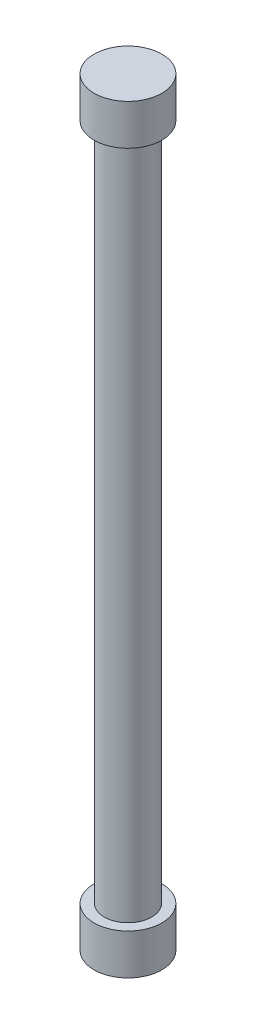
ISO-10303-21;
HEADER;
FILE_DESCRIPTION(('STEP AP214'),'2;1');
FILE_NAME('part.step','',(''),(''),'','','');
FILE_SCHEMA(('AUTOMOTIVE_DESIGN { 1 0 10303 214 1 1 1 1 }'));
ENDSEC;
DATA;
#1=APPLICATION_CONTEXT('core data for automotive mechanical design processes');
#2=APPLICATION_PROTOCOL_DEFINITION('international standard','automotive_design',2000,#1);
#3=PRODUCT_CONTEXT('',#1,'mechanical');
#4=PRODUCT('Part','Part','',(#3));
#5=PRODUCT_RELATED_PRODUCT_CATEGORY('part','',(#4));
#6=PRODUCT_DEFINITION_FORMATION('','',#4);
#7=PRODUCT_DEFINITION_CONTEXT('part definition',#1,'design');
#8=PRODUCT_DEFINITION('design','',#6,#7);
#9=PRODUCT_DEFINITION_SHAPE('','',#8);
#10=(LENGTH_UNIT() NAMED_UNIT(*) SI_UNIT(.MILLI.,.METRE.));
#11=(NAMED_UNIT(*) PLANE_ANGLE_UNIT() SI_UNIT($,.RADIAN.));
#12=(NAMED_UNIT(*) SI_UNIT($,.STERADIAN.) SOLID_ANGLE_UNIT());
#13=UNCERTAINTY_MEASURE_WITH_UNIT(LENGTH_MEASURE(1.E-05),#10,'distance_accuracy_value','');
#14=(GEOMETRIC_REPRESENTATION_CONTEXT(3) GLOBAL_UNCERTAINTY_ASSIGNED_CONTEXT((#13)) GLOBAL_UNIT_ASSIGNED_CONTEXT((#10,
#11,#12)) REPRESENTATION_CONTEXT('',''));
#15=CARTESIAN_POINT('',(0.,0.,0.));
#16=DIRECTION('',(0.,0.,1.));
#17=DIRECTION('',(1.,0.,0.));
#18=AXIS2_PLACEMENT_3D('',#15,#16,#17);
#19=CARTESIAN_POINT('',(0.,3.,0.));
#20=DIRECTION('',(0.,-1.,0.));
#21=DIRECTION('',(0.,0.,-1.));
#22=AXIS2_PLACEMENT_3D('',#19,#20,#21);
#23=CYLINDRICAL_SURFACE('',#22,2.5);
#24=CARTESIAN_POINT('',(0.,3.,0.));
#25=DIRECTION('',(0.,1.,0.));
#26=DIRECTION('',(0.,0.,1.));
#27=AXIS2_PLACEMENT_3D('',#24,#25,#26);
#28=CIRCLE('',#27,2.5);
#29=CARTESIAN_POINT('',(0.,3.,2.5));
#30=VERTEX_POINT('',#29);
#31=EDGE_CURVE('E45',#30,#30,#28,.T.);
#32=ORIENTED_EDGE('',*,*,#31,.F.);
#33=EDGE_LOOP('',(#32));
#34=FACE_BOUND('',#33,.T.);
#35=CARTESIAN_POINT('',(0.,0.,0.));
#36=DIRECTION('',(0.,1.,0.));
#37=DIRECTION('',(0.,0.,1.));
#38=AXIS2_PLACEMENT_3D('',#35,#36,#37);
#39=CIRCLE('',#38,2.5);
#40=CARTESIAN_POINT('',(0.,0.,2.5));
#41=VERTEX_POINT('',#40);
#42=EDGE_CURVE('E40',#41,#41,#39,.T.);
#43=ORIENTED_EDGE('',*,*,#42,.T.);
#44=EDGE_LOOP('',(#43));
#45=FACE_BOUND('',#44,.T.);
#46=ADVANCED_FACE('F37',(#34,#45),#23,.T.);
#47=CARTESIAN_POINT('',(0.,3.,0.));
#48=DIRECTION('',(0.,1.,0.));
#49=DIRECTION('',(0.,0.,1.));
#50=AXIS2_PLACEMENT_3D('',#47,#48,#49);
#51=PLANE('',#50);
#52=CARTESIAN_POINT('',(0.,3.,0.));
#53=DIRECTION('',(0.,1.,0.));
#54=DIRECTION('',(0.,0.,1.));
#55=AXIS2_PLACEMENT_3D('',#52,#53,#54);
#56=CIRCLE('',#55,1.75);
#57=CARTESIAN_POINT('',(0.,3.,1.75));
#58=VERTEX_POINT('',#57);
#59=EDGE_CURVE('E10',#58,#58,#56,.T.);
#60=ORIENTED_EDGE('',*,*,#59,.F.);
#61=EDGE_LOOP('',(#60));
#62=FACE_BOUND('',#61,.T.);
#63=ORIENTED_EDGE('',*,*,#31,.T.);
#64=EDGE_LOOP('',(#63));
#65=FACE_BOUND('',#64,.T.);
#66=ADVANCED_FACE('F83',(#62,#65),#51,.T.);
#67=CARTESIAN_POINT('',(0.,0.,0.));
#68=DIRECTION('',(0.,1.,0.));
#69=DIRECTION('',(0.,0.,1.));
#70=AXIS2_PLACEMENT_3D('',#67,#68,#69);
#71=PLANE('',#70);
#72=ORIENTED_EDGE('',*,*,#42,.F.);
#73=EDGE_LOOP('',(#72));
#74=FACE_BOUND('',#73,.T.);
#75=ADVANCED_FACE('F88',(#74),#71,.F.);
#76=CARTESIAN_POINT('',(0.,53.,0.));
#77=DIRECTION('',(0.,-1.,0.));
#78=DIRECTION('',(0.,0.,-1.));
#79=AXIS2_PLACEMENT_3D('',#76,#77,#78);
#80=CYLINDRICAL_SURFACE('',#79,1.75);
#81=CARTESIAN_POINT('',(0.,53.,0.));
#82=DIRECTION('',(0.,1.,0.));
#83=DIRECTION('',(0.,0.,1.));
#84=AXIS2_PLACEMENT_3D('',#81,#82,#83);
#85=CIRCLE('',#84,1.75);
#86=CARTESIAN_POINT('',(0.,53.,1.75));
#87=VERTEX_POINT('',#86);
#88=EDGE_CURVE('E52',#87,#87,#85,.T.);
#89=ORIENTED_EDGE('',*,*,#88,.F.);
#90=EDGE_LOOP('',(#89));
#91=FACE_BOUND('',#90,.T.);
#92=ORIENTED_EDGE('',*,*,#59,.T.);
#93=EDGE_LOOP('',(#92));
#94=FACE_BOUND('',#93,.T.);
#95=ADVANCED_FACE('F70',(#91,#94),#80,.T.);
#96=CARTESIAN_POINT('',(0.,56.,0.));
#97=DIRECTION('',(0.,-1.,0.));
#98=DIRECTION('',(0.,0.,-1.));
#99=AXIS2_PLACEMENT_3D('',#96,#97,#98);
#100=CYLINDRICAL_SURFACE('',#99,2.5);
#101=CARTESIAN_POINT('',(0.,56.,0.));
#102=DIRECTION('',(0.,1.,0.));
#103=DIRECTION('',(0.,0.,1.));
#104=AXIS2_PLACEMENT_3D('',#101,#102,#103);
#105=CIRCLE('',#104,2.5);
#106=CARTESIAN_POINT('',(0.,56.,2.5));
#107=VERTEX_POINT('',#106);
#108=EDGE_CURVE('E56',#107,#107,#105,.T.);
#109=ORIENTED_EDGE('',*,*,#108,.F.);
#110=EDGE_LOOP('',(#109));
#111=FACE_BOUND('',#110,.T.);
#112=CARTESIAN_POINT('',(0.,53.,0.));
#113=DIRECTION('',(0.,1.,0.));
#114=DIRECTION('',(0.,0.,1.));
#115=AXIS2_PLACEMENT_3D('',#112,#113,#114);
#116=CIRCLE('',#115,2.5);
#117=CARTESIAN_POINT('',(0.,53.,2.5));
#118=VERTEX_POINT('',#117);
#119=EDGE_CURVE('E57',#118,#118,#116,.T.);
#120=ORIENTED_EDGE('',*,*,#119,.T.);
#121=EDGE_LOOP('',(#120));
#122=FACE_BOUND('',#121,.T.);
#123=ADVANCED_FACE('F67',(#111,#122),#100,.T.);
#124=CARTESIAN_POINT('',(0.,56.,0.));
#125=DIRECTION('',(0.,1.,0.));
#126=DIRECTION('',(0.,0.,1.));
#127=AXIS2_PLACEMENT_3D('',#124,#125,#126);
#128=PLANE('',#127);
#129=ORIENTED_EDGE('',*,*,#108,.T.);
#130=EDGE_LOOP('',(#129));
#131=FACE_BOUND('',#130,.T.);
#132=ADVANCED_FACE('F65',(#131),#128,.T.);
#133=CARTESIAN_POINT('',(0.,53.,0.));
#134=DIRECTION('',(0.,1.,0.));
#135=DIRECTION('',(0.,0.,1.));
#136=AXIS2_PLACEMENT_3D('',#133,#134,#135);
#137=PLANE('',#136);
#138=ORIENTED_EDGE('',*,*,#88,.T.);
#139=EDGE_LOOP('',(#138));
#140=FACE_BOUND('',#139,.T.);
#141=ORIENTED_EDGE('',*,*,#119,.F.);
#142=EDGE_LOOP('',(#141));
#143=FACE_BOUND('',#142,.T.);
#144=ADVANCED_FACE('F74',(#140,#143),#137,.F.);
#145=CLOSED_SHELL('',(#46,#66,#75,#95,#123,#132,#144));
#146=MANIFOLD_SOLID_BREP('B2',#145);
#147=ADVANCED_BREP_SHAPE_REPRESENTATION('',(#18,#146),#14);
#148=SHAPE_DEFINITION_REPRESENTATION(#9,#147);
ENDSEC;
END-ISO-10303-21;
